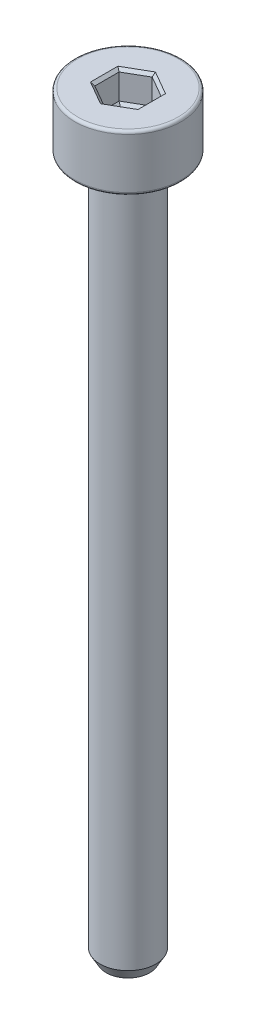
ISO-10303-21;
HEADER;
FILE_DESCRIPTION(('STEP AP214'),'2;1');
FILE_NAME('part.step','',(''),(''),'','','');
FILE_SCHEMA(('AUTOMOTIVE_DESIGN { 1 0 10303 214 1 1 1 1 }'));
ENDSEC;
DATA;
#1=APPLICATION_CONTEXT('core data for automotive mechanical design processes');
#2=APPLICATION_PROTOCOL_DEFINITION('international standard','automotive_design',2000,#1);
#3=PRODUCT_CONTEXT('',#1,'mechanical');
#4=PRODUCT('Part','Part','',(#3));
#5=PRODUCT_RELATED_PRODUCT_CATEGORY('part','',(#4));
#6=PRODUCT_DEFINITION_FORMATION('','',#4);
#7=PRODUCT_DEFINITION_CONTEXT('part definition',#1,'design');
#8=PRODUCT_DEFINITION('design','',#6,#7);
#9=PRODUCT_DEFINITION_SHAPE('','',#8);
#10=(LENGTH_UNIT() NAMED_UNIT(*) SI_UNIT(.MILLI.,.METRE.));
#11=(NAMED_UNIT(*) PLANE_ANGLE_UNIT() SI_UNIT($,.RADIAN.));
#12=(NAMED_UNIT(*) SI_UNIT($,.STERADIAN.) SOLID_ANGLE_UNIT());
#13=UNCERTAINTY_MEASURE_WITH_UNIT(LENGTH_MEASURE(1.E-05),#10,'distance_accuracy_value','');
#14=(GEOMETRIC_REPRESENTATION_CONTEXT(3) GLOBAL_UNCERTAINTY_ASSIGNED_CONTEXT((#13)) GLOBAL_UNIT_ASSIGNED_CONTEXT((#10,
#11,#12)) REPRESENTATION_CONTEXT('',''));
#15=CARTESIAN_POINT('',(0.,0.,0.));
#16=DIRECTION('',(0.,0.,1.));
#17=DIRECTION('',(1.,0.,0.));
#18=AXIS2_PLACEMENT_3D('',#15,#16,#17);
#19=CARTESIAN_POINT('',(0.,25.,0.));
#20=DIRECTION('',(0.,-1.,0.));
#21=DIRECTION('',(0.,0.,-1.));
#22=AXIS2_PLACEMENT_3D('',#19,#20,#21);
#23=CYLINDRICAL_SURFACE('',#22,0.999999999999999);
#24=CARTESIAN_POINT('',(0.,0.382679491924304,0.));
#25=DIRECTION('',(0.,1.,0.));
#26=DIRECTION('',(-1.,0.,0.));
#27=AXIS2_PLACEMENT_3D('',#24,#25,#26);
#28=CIRCLE('',#27,0.999999999999999);
#29=CARTESIAN_POINT('',(-1.,0.382679491924301,0.));
#30=VERTEX_POINT('',#29);
#31=EDGE_CURVE('E290',#30,#30,#28,.T.);
#32=ORIENTED_EDGE('',*,*,#31,.T.);
#33=EDGE_LOOP('',(#32));
#34=FACE_BOUND('',#33,.T.);
#35=CARTESIAN_POINT('',(0.,25.,0.));
#36=DIRECTION('',(0.,1.,0.));
#37=DIRECTION('',(0.,0.,1.));
#38=AXIS2_PLACEMENT_3D('',#35,#36,#37);
#39=CIRCLE('',#38,0.999999999999999);
#40=CARTESIAN_POINT('',(0.,25.,0.999999999999999));
#41=VERTEX_POINT('',#40);
#42=EDGE_CURVE('E198',#41,#41,#39,.T.);
#43=ORIENTED_EDGE('',*,*,#42,.F.);
#44=EDGE_LOOP('',(#43));
#45=FACE_BOUND('',#44,.T.);
#46=ADVANCED_FACE('F47',(#34,#45),#23,.T.);
#47=CARTESIAN_POINT('',(0.,27.,0.));
#48=DIRECTION('',(0.,-1.,0.));
#49=DIRECTION('',(0.,0.,-1.));
#50=AXIS2_PLACEMENT_3D('',#47,#48,#49);
#51=CYLINDRICAL_SURFACE('',#50,1.9);
#52=CARTESIAN_POINT('',(0.,25.1,0.));
#53=DIRECTION('',(0.,1.,0.));
#54=DIRECTION('',(0.,0.,1.));
#55=AXIS2_PLACEMENT_3D('',#52,#53,#54);
#56=CIRCLE('',#55,1.9);
#57=CARTESIAN_POINT('',(0.,25.1,1.9));
#58=VERTEX_POINT('',#57);
#59=EDGE_CURVE('E217',#58,#58,#56,.T.);
#60=ORIENTED_EDGE('',*,*,#59,.T.);
#61=EDGE_LOOP('',(#60));
#62=FACE_BOUND('',#61,.T.);
#63=CARTESIAN_POINT('',(0.,26.9,0.));
#64=DIRECTION('',(0.,1.,0.));
#65=DIRECTION('',(0.,0.,1.));
#66=AXIS2_PLACEMENT_3D('',#63,#64,#65);
#67=CIRCLE('',#66,1.9);
#68=CARTESIAN_POINT('',(0.,26.9,1.9));
#69=VERTEX_POINT('',#68);
#70=EDGE_CURVE('E213',#69,#69,#67,.F.);
#71=ORIENTED_EDGE('',*,*,#70,.T.);
#72=EDGE_LOOP('',(#71));
#73=FACE_BOUND('',#72,.T.);
#74=ADVANCED_FACE('F376',(#62,#73),#51,.T.);
#75=CARTESIAN_POINT('',(0.,27.,0.));
#76=DIRECTION('',(0.,1.,0.));
#77=DIRECTION('',(0.,0.,1.));
#78=AXIS2_PLACEMENT_3D('',#75,#76,#77);
#79=PLANE('',#78);
#80=DIRECTION('',(-0.866025403784439,0.,-0.5));
#81=VECTOR('',#80,1.);
#82=CARTESIAN_POINT('',(-0.799999999999999,27.,0.519615242270661));
#83=LINE('',#82,#81);
#84=CARTESIAN_POINT('',(0.,27.,0.981495457622362));
#85=VERTEX_POINT('',#84);
#86=CARTESIAN_POINT('',(-0.849999999999998,27.,0.490747728811181));
#87=VERTEX_POINT('',#86);
#88=EDGE_CURVE('E244',#85,#87,#83,.T.);
#89=ORIENTED_EDGE('',*,*,#88,.T.);
#90=DIRECTION('',(0.,0.,-1.));
#91=VECTOR('',#90,1.);
#92=CARTESIAN_POINT('',(-0.849999999999998,27.,-0.43301270189222));
#93=LINE('',#92,#91);
#94=CARTESIAN_POINT('',(-0.849999999999998,27.,-0.490747728811181));
#95=VERTEX_POINT('',#94);
#96=EDGE_CURVE('E247',#87,#95,#93,.T.);
#97=ORIENTED_EDGE('',*,*,#96,.T.);
#98=DIRECTION('',(0.866025403784439,0.,-0.5));
#99=VECTOR('',#98,1.);
#100=CARTESIAN_POINT('',(-0.0499999999999989,27.,-0.952627944162881));
#101=LINE('',#100,#99);
#102=CARTESIAN_POINT('',(0.,27.,-0.981495457622362));
#103=VERTEX_POINT('',#102);
#104=EDGE_CURVE('E232',#95,#103,#101,.T.);
#105=ORIENTED_EDGE('',*,*,#104,.T.);
#106=DIRECTION('',(0.866025403784439,0.,0.5));
#107=VECTOR('',#106,1.);
#108=CARTESIAN_POINT('',(0.799999999999998,27.,-0.519615242270662));
#109=LINE('',#108,#107);
#110=CARTESIAN_POINT('',(0.849999999999997,27.,-0.490747728811181));
#111=VERTEX_POINT('',#110);
#112=EDGE_CURVE('E235',#103,#111,#109,.T.);
#113=ORIENTED_EDGE('',*,*,#112,.T.);
#114=DIRECTION('',(0.,0.,1.));
#115=VECTOR('',#114,1.);
#116=CARTESIAN_POINT('',(0.849999999999997,27.,0.43301270189222));
#117=LINE('',#116,#115);
#118=CARTESIAN_POINT('',(0.849999999999997,27.,0.490747728811182));
#119=VERTEX_POINT('',#118);
#120=EDGE_CURVE('E238',#111,#119,#117,.T.);
#121=ORIENTED_EDGE('',*,*,#120,.T.);
#122=DIRECTION('',(-0.866025403784439,0.,0.5));
#123=VECTOR('',#122,1.);
#124=CARTESIAN_POINT('',(0.0499999999999987,27.,0.952627944162881));
#125=LINE('',#124,#123);
#126=EDGE_CURVE('E241',#119,#85,#125,.T.);
#127=ORIENTED_EDGE('',*,*,#126,.T.);
#128=EDGE_LOOP('',(#89,#97,#105,#113,#121,#127));
#129=FACE_BOUND('',#128,.T.);
#130=CARTESIAN_POINT('',(0.,27.,0.));
#131=DIRECTION('',(0.,1.,0.));
#132=DIRECTION('',(0.,0.,1.));
#133=AXIS2_PLACEMENT_3D('',#130,#131,#132);
#134=CIRCLE('',#133,1.8);
#135=CARTESIAN_POINT('',(0.,27.,1.8));
#136=VERTEX_POINT('',#135);
#137=EDGE_CURVE('E225',#136,#136,#134,.T.);
#138=ORIENTED_EDGE('',*,*,#137,.T.);
#139=EDGE_LOOP('',(#138));
#140=FACE_BOUND('',#139,.T.);
#141=ADVANCED_FACE('F384',(#129,#140),#79,.T.);
#142=CARTESIAN_POINT('',(0.,25.,0.));
#143=DIRECTION('',(0.,1.,0.));
#144=DIRECTION('',(0.,0.,1.));
#145=AXIS2_PLACEMENT_3D('',#142,#143,#144);
#146=PLANE('',#145);
#147=CARTESIAN_POINT('',(0.,25.,0.));
#148=DIRECTION('',(0.,1.,0.));
#149=DIRECTION('',(0.,0.,1.));
#150=AXIS2_PLACEMENT_3D('',#147,#148,#149);
#151=CIRCLE('',#150,1.8);
#152=CARTESIAN_POINT('',(0.,25.,1.8));
#153=VERTEX_POINT('',#152);
#154=EDGE_CURVE('E221',#153,#153,#151,.F.);
#155=ORIENTED_EDGE('',*,*,#154,.T.);
#156=EDGE_LOOP('',(#155));
#157=FACE_BOUND('',#156,.T.);
#158=ORIENTED_EDGE('',*,*,#42,.T.);
#159=EDGE_LOOP('',(#158));
#160=FACE_BOUND('',#159,.T.);
#161=ADVANCED_FACE('F372',(#157,#160),#146,.F.);
#162=CARTESIAN_POINT('',(0.749999999999999,26.,-0.43301270189222));
#163=DIRECTION('',(0.5,0.,-0.866025403784439));
#164=DIRECTION('',(-0.866025403784439,0.,-0.5));
#165=AXIS2_PLACEMENT_3D('',#162,#163,#164);
#166=PLANE('',#165);
#167=DIRECTION('',(0.,1.,0.));
#168=VECTOR('',#167,1.);
#169=CARTESIAN_POINT('',(0.749999999999999,26.,-0.43301270189222));
#170=LINE('',#169,#168);
#171=CARTESIAN_POINT('',(0.749999999999995,26.,-0.433012701892228));
#172=VERTEX_POINT('',#171);
#173=CARTESIAN_POINT('',(0.749999999999999,26.9,-0.43301270189222));
#174=VERTEX_POINT('',#173);
#175=EDGE_CURVE('E195',#172,#174,#170,.T.);
#176=ORIENTED_EDGE('',*,*,#175,.T.);
#177=DIRECTION('',(-0.866025403784439,0.,-0.5));
#178=VECTOR('',#177,1.);
#179=CARTESIAN_POINT('',(0.,26.9,-0.866025403784439));
#180=LINE('',#179,#178);
#181=CARTESIAN_POINT('',(0.,26.9,-0.866025403784439));
#182=VERTEX_POINT('',#181);
#183=EDGE_CURVE('E58',#174,#182,#180,.T.);
#184=ORIENTED_EDGE('',*,*,#183,.T.);
#185=DIRECTION('',(0.,1.,0.));
#186=VECTOR('',#185,1.);
#187=CARTESIAN_POINT('',(0.,26.,-0.866025403784439));
#188=LINE('',#187,#186);
#189=CARTESIAN_POINT('',(0.,26.,-0.866025403784439));
#190=VERTEX_POINT('',#189);
#191=EDGE_CURVE('E174',#190,#182,#188,.T.);
#192=ORIENTED_EDGE('',*,*,#191,.F.);
#193=DIRECTION('',(-0.866025403784439,0.,-0.5));
#194=VECTOR('',#193,1.);
#195=CARTESIAN_POINT('',(0.749999999999999,26.,-0.43301270189222));
#196=LINE('',#195,#194);
#197=EDGE_CURVE('E163',#172,#190,#196,.T.);
#198=ORIENTED_EDGE('',*,*,#197,.F.);
#199=EDGE_LOOP('',(#176,#184,#192,#198));
#200=FACE_BOUND('',#199,.T.);
#201=ADVANCED_FACE('F305',(#200),#166,.F.);
#202=CARTESIAN_POINT('',(0.749999999999999,26.,0.43301270189222));
#203=DIRECTION('',(1.,0.,0.));
#204=DIRECTION('',(0.,0.,-1.));
#205=AXIS2_PLACEMENT_3D('',#202,#203,#204);
#206=PLANE('',#205);
#207=DIRECTION('',(0.,1.,0.));
#208=VECTOR('',#207,1.);
#209=CARTESIAN_POINT('',(0.749999999999999,26.,0.43301270189222));
#210=LINE('',#209,#208);
#211=CARTESIAN_POINT('',(0.750000000000004,26.,0.433012701892213));
#212=VERTEX_POINT('',#211);
#213=CARTESIAN_POINT('',(0.749999999999999,26.9,0.43301270189222));
#214=VERTEX_POINT('',#213);
#215=EDGE_CURVE('E199',#212,#214,#210,.T.);
#216=ORIENTED_EDGE('',*,*,#215,.T.);
#217=DIRECTION('',(0.,0.,-1.));
#218=VECTOR('',#217,1.);
#219=CARTESIAN_POINT('',(0.749999999999999,26.9,-0.43301270189222));
#220=LINE('',#219,#218);
#221=EDGE_CURVE('E73',#214,#174,#220,.T.);
#222=ORIENTED_EDGE('',*,*,#221,.T.);
#223=ORIENTED_EDGE('',*,*,#175,.F.);
#224=DIRECTION('',(0.,0.,-1.));
#225=VECTOR('',#224,1.);
#226=CARTESIAN_POINT('',(0.749999999999999,26.,0.43301270189222));
#227=LINE('',#226,#225);
#228=EDGE_CURVE('E191',#212,#172,#227,.T.);
#229=ORIENTED_EDGE('',*,*,#228,.F.);
#230=EDGE_LOOP('',(#216,#222,#223,#229));
#231=FACE_BOUND('',#230,.T.);
#232=ADVANCED_FACE('F361',(#231),#206,.F.);
#233=CARTESIAN_POINT('',(0.,26.,0.866025403784439));
#234=DIRECTION('',(0.5,0.,0.866025403784439));
#235=DIRECTION('',(0.866025403784439,0.,-0.5));
#236=AXIS2_PLACEMENT_3D('',#233,#234,#235);
#237=PLANE('',#236);
#238=DIRECTION('',(0.,1.,0.));
#239=VECTOR('',#238,1.);
#240=CARTESIAN_POINT('',(0.,26.,0.866025403784439));
#241=LINE('',#240,#239);
#242=CARTESIAN_POINT('',(0.,26.,0.866025403784439));
#243=VERTEX_POINT('',#242);
#244=CARTESIAN_POINT('',(0.,26.9,0.866025403784439));
#245=VERTEX_POINT('',#244);
#246=EDGE_CURVE('E202',#243,#245,#241,.T.);
#247=ORIENTED_EDGE('',*,*,#246,.T.);
#248=DIRECTION('',(0.866025403784439,0.,-0.5));
#249=VECTOR('',#248,1.);
#250=CARTESIAN_POINT('',(0.749999999999999,26.9,0.43301270189222));
#251=LINE('',#250,#249);
#252=EDGE_CURVE('E254',#245,#214,#251,.T.);
#253=ORIENTED_EDGE('',*,*,#252,.T.);
#254=ORIENTED_EDGE('',*,*,#215,.F.);
#255=DIRECTION('',(0.866025403784439,0.,-0.5));
#256=VECTOR('',#255,1.);
#257=CARTESIAN_POINT('',(0.,26.,0.866025403784439));
#258=LINE('',#257,#256);
#259=EDGE_CURVE('E184',#243,#212,#258,.T.);
#260=ORIENTED_EDGE('',*,*,#259,.F.);
#261=EDGE_LOOP('',(#247,#253,#254,#260));
#262=FACE_BOUND('',#261,.T.);
#263=ADVANCED_FACE('F364',(#262),#237,.F.);
#264=CARTESIAN_POINT('',(-0.75,26.,0.43301270189222));
#265=DIRECTION('',(-0.5,0.,0.866025403784438));
#266=DIRECTION('',(0.866025403784439,0.,0.5));
#267=AXIS2_PLACEMENT_3D('',#264,#265,#266);
#268=PLANE('',#267);
#269=DIRECTION('',(0.,1.,0.));
#270=VECTOR('',#269,1.);
#271=CARTESIAN_POINT('',(-0.75,26.,0.43301270189222));
#272=LINE('',#271,#270);
#273=CARTESIAN_POINT('',(-0.749999999999998,26.,0.433012701892223));
#274=VERTEX_POINT('',#273);
#275=CARTESIAN_POINT('',(-0.75,26.9,0.43301270189222));
#276=VERTEX_POINT('',#275);
#277=EDGE_CURVE('E173',#274,#276,#272,.T.);
#278=ORIENTED_EDGE('',*,*,#277,.T.);
#279=DIRECTION('',(0.866025403784439,0.,0.5));
#280=VECTOR('',#279,1.);
#281=CARTESIAN_POINT('',(0.,26.9,0.866025403784439));
#282=LINE('',#281,#280);
#283=EDGE_CURVE('E251',#276,#245,#282,.T.);
#284=ORIENTED_EDGE('',*,*,#283,.T.);
#285=ORIENTED_EDGE('',*,*,#246,.F.);
#286=DIRECTION('',(0.866025403784438,0.,0.5));
#287=VECTOR('',#286,1.);
#288=CARTESIAN_POINT('',(-0.75,26.,0.43301270189222));
#289=LINE('',#288,#287);
#290=EDGE_CURVE('E180',#274,#243,#289,.T.);
#291=ORIENTED_EDGE('',*,*,#290,.F.);
#292=EDGE_LOOP('',(#278,#284,#285,#291));
#293=FACE_BOUND('',#292,.T.);
#294=ADVANCED_FACE('F318',(#293),#268,.F.);
#295=CARTESIAN_POINT('',(-0.75,26.,-0.43301270189222));
#296=DIRECTION('',(-1.,0.,0.));
#297=DIRECTION('',(0.,0.,1.));
#298=AXIS2_PLACEMENT_3D('',#295,#296,#297);
#299=PLANE('',#298);
#300=DIRECTION('',(0.,1.,0.));
#301=VECTOR('',#300,1.);
#302=CARTESIAN_POINT('',(-0.75,26.,-0.43301270189222));
#303=LINE('',#302,#301);
#304=CARTESIAN_POINT('',(-0.750000000000001,26.,-0.433012701892218));
#305=VERTEX_POINT('',#304);
#306=CARTESIAN_POINT('',(-0.75,26.9,-0.43301270189222));
#307=VERTEX_POINT('',#306);
#308=EDGE_CURVE('E166',#305,#307,#303,.T.);
#309=ORIENTED_EDGE('',*,*,#308,.T.);
#310=DIRECTION('',(0.,0.,1.));
#311=VECTOR('',#310,1.);
#312=CARTESIAN_POINT('',(-0.75,26.9,0.43301270189222));
#313=LINE('',#312,#311);
#314=EDGE_CURVE('E229',#307,#276,#313,.T.);
#315=ORIENTED_EDGE('',*,*,#314,.T.);
#316=ORIENTED_EDGE('',*,*,#277,.F.);
#317=DIRECTION('',(0.,0.,1.));
#318=VECTOR('',#317,1.);
#319=CARTESIAN_POINT('',(-0.75,26.,-0.43301270189222));
#320=LINE('',#319,#318);
#321=EDGE_CURVE('E145',#305,#274,#320,.T.);
#322=ORIENTED_EDGE('',*,*,#321,.F.);
#323=EDGE_LOOP('',(#309,#315,#316,#322));
#324=FACE_BOUND('',#323,.T.);
#325=ADVANCED_FACE('F176',(#324),#299,.F.);
#326=CARTESIAN_POINT('',(0.,26.,-0.866025403784439));
#327=DIRECTION('',(-0.5,0.,-0.866025403784439));
#328=DIRECTION('',(-0.866025403784439,0.,0.5));
#329=AXIS2_PLACEMENT_3D('',#326,#327,#328);
#330=PLANE('',#329);
#331=ORIENTED_EDGE('',*,*,#191,.T.);
#332=DIRECTION('',(-0.866025403784439,0.,0.5));
#333=VECTOR('',#332,1.);
#334=CARTESIAN_POINT('',(-0.75,26.9,-0.43301270189222));
#335=LINE('',#334,#333);
#336=EDGE_CURVE('E11',#182,#307,#335,.T.);
#337=ORIENTED_EDGE('',*,*,#336,.T.);
#338=ORIENTED_EDGE('',*,*,#308,.F.);
#339=DIRECTION('',(-0.866025403784439,0.,0.5));
#340=VECTOR('',#339,1.);
#341=CARTESIAN_POINT('',(0.,26.,-0.866025403784439));
#342=LINE('',#341,#340);
#343=EDGE_CURVE('E158',#190,#305,#342,.T.);
#344=ORIENTED_EDGE('',*,*,#343,.F.);
#345=EDGE_LOOP('',(#331,#337,#338,#344));
#346=FACE_BOUND('',#345,.T.);
#347=ADVANCED_FACE('F167',(#346),#330,.F.);
#348=CARTESIAN_POINT('',(0.,25.1,0.));
#349=DIRECTION('',(0.,1.,0.));
#350=DIRECTION('',(0.,0.,1.));
#351=AXIS2_PLACEMENT_3D('',#348,#349,#350);
#352=TOROIDAL_SURFACE('',#351,1.8,0.1);
#353=ORIENTED_EDGE('',*,*,#154,.F.);
#354=EDGE_LOOP('',(#353));
#355=FACE_BOUND('',#354,.T.);
#356=ORIENTED_EDGE('',*,*,#59,.F.);
#357=EDGE_LOOP('',(#356));
#358=FACE_BOUND('',#357,.T.);
#359=ADVANCED_FACE('F391',(#355,#358),#352,.T.);
#360=CARTESIAN_POINT('',(0.,26.9,0.));
#361=DIRECTION('',(0.,1.,0.));
#362=DIRECTION('',(0.,0.,1.));
#363=AXIS2_PLACEMENT_3D('',#360,#361,#362);
#364=TOROIDAL_SURFACE('',#363,1.8,0.1);
#365=ORIENTED_EDGE('',*,*,#70,.F.);
#366=EDGE_LOOP('',(#365));
#367=FACE_BOUND('',#366,.T.);
#368=ORIENTED_EDGE('',*,*,#137,.F.);
#369=EDGE_LOOP('',(#368));
#370=FACE_BOUND('',#369,.T.);
#371=ADVANCED_FACE('F394',(#367,#370),#364,.T.);
#372=CARTESIAN_POINT('',(0.,0.399999999999997,0.));
#373=DIRECTION('',(0.,1.,0.));
#374=DIRECTION('',(-1.,0.,0.));
#375=AXIS2_PLACEMENT_3D('',#372,#373,#374);
#376=CONICAL_SURFACE('',#375,1.01,0.523598775598307);
#377=CARTESIAN_POINT('',(0.,0.,0.));
#378=DIRECTION('',(0.,-1.,0.));
#379=DIRECTION('',(1.,0.,0.));
#380=AXIS2_PLACEMENT_3D('',#377,#378,#379);
#381=CIRCLE('',#380,0.779059892324147);
#382=CARTESIAN_POINT('',(0.779059892324147,0.,0.));
#383=VERTEX_POINT('',#382);
#384=EDGE_CURVE('E284',#383,#383,#381,.T.);
#385=ORIENTED_EDGE('',*,*,#384,.F.);
#386=EDGE_LOOP('',(#385));
#387=FACE_BOUND('',#386,.T.);
#388=ORIENTED_EDGE('',*,*,#31,.F.);
#389=EDGE_LOOP('',(#388));
#390=FACE_BOUND('',#389,.T.);
#391=ADVANCED_FACE('F397',(#387,#390),#376,.T.);
#392=CARTESIAN_POINT('',(0.,0.,0.));
#393=DIRECTION('',(0.,1.,0.));
#394=DIRECTION('',(0.,0.,1.));
#395=AXIS2_PLACEMENT_3D('',#392,#393,#394);
#396=PLANE('',#395);
#397=ORIENTED_EDGE('',*,*,#384,.T.);
#398=EDGE_LOOP('',(#397));
#399=FACE_BOUND('',#398,.T.);
#400=ADVANCED_FACE('F390',(#399),#396,.F.);
#401=CARTESIAN_POINT('',(0.749999999999999,26.9,0.43301270189222));
#402=DIRECTION('',(-0.707106781186566,0.70710678118653,0.));
#403=DIRECTION('',(0.,0.,1.));
#404=AXIS2_PLACEMENT_3D('',#401,#402,#403);
#405=PLANE('',#404);
#406=DIRECTION('',(0.654653670707963,0.654653670707996,0.37796447300922));
#407=VECTOR('',#406,1.);
#408=CARTESIAN_POINT('',(0.535714285714295,26.6857142857143,0.309294787065877));
#409=LINE('',#408,#407);
#410=EDGE_CURVE('E275',#119,#214,#409,.F.);
#411=ORIENTED_EDGE('',*,*,#410,.F.);
#412=ORIENTED_EDGE('',*,*,#120,.F.);
#413=DIRECTION('',(0.654653670707963,0.654653670707996,-0.37796447300922));
#414=VECTOR('',#413,1.);
#415=CARTESIAN_POINT('',(0.535714285714294,26.6857142857143,-0.309294787065876));
#416=LINE('',#415,#414);
#417=EDGE_CURVE('E52',#174,#111,#416,.T.);
#418=ORIENTED_EDGE('',*,*,#417,.F.);
#419=ORIENTED_EDGE('',*,*,#221,.F.);
#420=EDGE_LOOP('',(#411,#412,#418,#419));
#421=FACE_BOUND('',#420,.T.);
#422=ADVANCED_FACE('F50',(#421),#405,.T.);
#423=CARTESIAN_POINT('',(0.749999999999999,26.9,-0.43301270189222));
#424=DIRECTION('',(-0.353553390593283,0.70710678118653,0.61237243569581));
#425=DIRECTION('',(0.866025403784439,0.,0.5));
#426=AXIS2_PLACEMENT_3D('',#423,#424,#425);
#427=PLANE('',#426);
#428=ORIENTED_EDGE('',*,*,#417,.T.);
#429=ORIENTED_EDGE('',*,*,#112,.F.);
#430=DIRECTION('',(0.,0.654653670707996,-0.755928946018438));
#431=VECTOR('',#430,1.);
#432=CARTESIAN_POINT('',(0.,26.6857142857143,-0.618589574131754));
#433=LINE('',#432,#431);
#434=EDGE_CURVE('E272',#182,#103,#433,.T.);
#435=ORIENTED_EDGE('',*,*,#434,.F.);
#436=ORIENTED_EDGE('',*,*,#183,.F.);
#437=EDGE_LOOP('',(#428,#429,#435,#436));
#438=FACE_BOUND('',#437,.T.);
#439=ADVANCED_FACE('F307',(#438),#427,.T.);
#440=CARTESIAN_POINT('',(0.,26.9,0.866025403784439));
#441=DIRECTION('',(-0.353553390593283,0.70710678118653,-0.61237243569581));
#442=DIRECTION('',(-0.866025403784439,0.,0.5));
#443=AXIS2_PLACEMENT_3D('',#440,#441,#442);
#444=PLANE('',#443);
#445=ORIENTED_EDGE('',*,*,#410,.T.);
#446=ORIENTED_EDGE('',*,*,#252,.F.);
#447=DIRECTION('',(0.,0.654653670707996,0.755928946018438));
#448=VECTOR('',#447,1.);
#449=CARTESIAN_POINT('',(0.,26.6857142857143,0.618589574131752));
#450=LINE('',#449,#448);
#451=EDGE_CURVE('E268',#85,#245,#450,.F.);
#452=ORIENTED_EDGE('',*,*,#451,.F.);
#453=ORIENTED_EDGE('',*,*,#126,.F.);
#454=EDGE_LOOP('',(#445,#446,#452,#453));
#455=FACE_BOUND('',#454,.T.);
#456=ADVANCED_FACE('F417',(#455),#444,.T.);
#457=CARTESIAN_POINT('',(0.,26.9,-0.866025403784439));
#458=DIRECTION('',(0.353553390593283,0.707106781186529,0.61237243569581));
#459=DIRECTION('',(0.866025403784439,0.,-0.5));
#460=AXIS2_PLACEMENT_3D('',#457,#458,#459);
#461=PLANE('',#460);
#462=ORIENTED_EDGE('',*,*,#434,.T.);
#463=ORIENTED_EDGE('',*,*,#104,.F.);
#464=DIRECTION('',(0.654653670707963,-0.654653670707996,0.377964473009219));
#465=VECTOR('',#464,1.);
#466=CARTESIAN_POINT('',(-0.75,26.9,-0.43301270189222));
#467=LINE('',#466,#465);
#468=EDGE_CURVE('E264',#307,#95,#467,.F.);
#469=ORIENTED_EDGE('',*,*,#468,.F.);
#470=ORIENTED_EDGE('',*,*,#336,.F.);
#471=EDGE_LOOP('',(#462,#463,#469,#470));
#472=FACE_BOUND('',#471,.T.);
#473=ADVANCED_FACE('F310',(#472),#461,.T.);
#474=CARTESIAN_POINT('',(-0.75,26.9,0.43301270189222));
#475=DIRECTION('',(0.353553390593283,0.707106781186529,-0.61237243569581));
#476=DIRECTION('',(-0.866025403784439,0.,-0.5));
#477=AXIS2_PLACEMENT_3D('',#474,#475,#476);
#478=PLANE('',#477);
#479=ORIENTED_EDGE('',*,*,#451,.T.);
#480=ORIENTED_EDGE('',*,*,#283,.F.);
#481=DIRECTION('',(-0.654653670707963,0.654653670707996,0.377964473009218));
#482=VECTOR('',#481,1.);
#483=CARTESIAN_POINT('',(-0.535714285714296,26.6857142857143,0.309294787065877));
#484=LINE('',#483,#482);
#485=EDGE_CURVE('E261',#87,#276,#484,.F.);
#486=ORIENTED_EDGE('',*,*,#485,.F.);
#487=ORIENTED_EDGE('',*,*,#88,.F.);
#488=EDGE_LOOP('',(#479,#480,#486,#487));
#489=FACE_BOUND('',#488,.T.);
#490=ADVANCED_FACE('F405',(#489),#478,.T.);
#491=CARTESIAN_POINT('',(-0.75,26.9,-0.43301270189222));
#492=DIRECTION('',(0.707106781186566,0.70710678118653,0.));
#493=DIRECTION('',(0.,0.,-1.));
#494=AXIS2_PLACEMENT_3D('',#491,#492,#493);
#495=PLANE('',#494);
#496=ORIENTED_EDGE('',*,*,#468,.T.);
#497=ORIENTED_EDGE('',*,*,#96,.F.);
#498=ORIENTED_EDGE('',*,*,#485,.T.);
#499=ORIENTED_EDGE('',*,*,#314,.F.);
#500=EDGE_LOOP('',(#496,#497,#498,#499));
#501=FACE_BOUND('',#500,.T.);
#502=ADVANCED_FACE('F314',(#501),#495,.T.);
#503=CARTESIAN_POINT('',(0.749999999999995,26.,-0.433012701892228));
#504=DIRECTION('',(0.35355339059327,-0.707106781186549,-0.612372435695795));
#505=DIRECTION('',(0.,0.654653670707977,-0.755928946018455));
#506=AXIS2_PLACEMENT_3D('',#503,#504,#505);
#507=PLANE('',#506);
#508=ORIENTED_EDGE('',*,*,#197,.T.);
#509=DIRECTION('',(0.,0.654653670707976,-0.755928946018455));
#510=VECTOR('',#509,1.);
#511=CARTESIAN_POINT('',(0.,25.7857142857143,-0.618589574131745));
#512=LINE('',#511,#510);
#513=CARTESIAN_POINT('',(0.,25.9,-0.750555349946514));
#514=VERTEX_POINT('',#513);
#515=EDGE_CURVE('E154',#514,#190,#512,.T.);
#516=ORIENTED_EDGE('',*,*,#515,.F.);
#517=DIRECTION('',(-0.866025403784441,0.,-0.499999999999995));
#518=VECTOR('',#517,1.);
#519=CARTESIAN_POINT('',(0.324999999999998,25.9,-0.562916512459889));
#520=LINE('',#519,#518);
#521=CARTESIAN_POINT('',(0.649999999999996,25.9,-0.375277674973265));
#522=VERTEX_POINT('',#521);
#523=EDGE_CURVE('E337',#522,#514,#520,.T.);
#524=ORIENTED_EDGE('',*,*,#523,.F.);
#525=DIRECTION('',(0.654653670707975,0.654653670707976,-0.377964473009233));
#526=VECTOR('',#525,1.);
#527=CARTESIAN_POINT('',(0.535714285714282,25.7857142857143,-0.309294787065878));
#528=LINE('',#527,#526);
#529=EDGE_CURVE('E265',#522,#172,#528,.T.);
#530=ORIENTED_EDGE('',*,*,#529,.T.);
#531=EDGE_LOOP('',(#508,#516,#524,#530));
#532=FACE_BOUND('',#531,.T.);
#533=ADVANCED_FACE('F303',(#532),#507,.F.);
#534=CARTESIAN_POINT('',(0.750000000000004,26.,0.433012701892213));
#535=DIRECTION('',(0.707106781186546,-0.707106781186549,0.));
#536=DIRECTION('',(0.707106781186549,0.707106781186546,0.));
#537=AXIS2_PLACEMENT_3D('',#534,#535,#536);
#538=PLANE('',#537);
#539=ORIENTED_EDGE('',*,*,#228,.T.);
#540=ORIENTED_EDGE('',*,*,#529,.F.);
#541=DIRECTION('',(0.,0.,-1.));
#542=VECTOR('',#541,1.);
#543=CARTESIAN_POINT('',(0.65,25.9,0.));
#544=LINE('',#543,#542);
#545=CARTESIAN_POINT('',(0.650000000000004,25.9,0.375277674973251));
#546=VERTEX_POINT('',#545);
#547=EDGE_CURVE('E341',#546,#522,#544,.T.);
#548=ORIENTED_EDGE('',*,*,#547,.F.);
#549=DIRECTION('',(0.654653670707982,0.654653670707976,0.377964473009222));
#550=VECTOR('',#549,1.);
#551=CARTESIAN_POINT('',(0.535714285714287,25.7857142857143,0.309294787065865));
#552=LINE('',#551,#550);
#553=EDGE_CURVE('E331',#546,#212,#552,.T.);
#554=ORIENTED_EDGE('',*,*,#553,.T.);
#555=EDGE_LOOP('',(#539,#540,#548,#554));
#556=FACE_BOUND('',#555,.T.);
#557=ADVANCED_FACE('F356',(#556),#538,.F.);
#558=CARTESIAN_POINT('',(0.,26.,0.866025403784439));
#559=DIRECTION('',(0.353553390593278,-0.707106781186549,0.612372435695791));
#560=DIRECTION('',(0.,-0.654653670707974,-0.755928946018457));
#561=AXIS2_PLACEMENT_3D('',#558,#559,#560);
#562=PLANE('',#561);
#563=ORIENTED_EDGE('',*,*,#259,.T.);
#564=ORIENTED_EDGE('',*,*,#553,.F.);
#565=DIRECTION('',(0.866025403784435,0.,-0.500000000000007));
#566=VECTOR('',#565,1.);
#567=CARTESIAN_POINT('',(0.325000000000005,25.9,0.562916512459883));
#568=LINE('',#567,#566);
#569=CARTESIAN_POINT('',(0.,25.9,0.750555349946514));
#570=VERTEX_POINT('',#569);
#571=EDGE_CURVE('E345',#570,#546,#568,.T.);
#572=ORIENTED_EDGE('',*,*,#571,.F.);
#573=DIRECTION('',(0.,0.654653670707976,0.755928946018456));
#574=VECTOR('',#573,1.);
#575=CARTESIAN_POINT('',(0.,25.7857142857143,0.61858957413174));
#576=LINE('',#575,#574);
#577=EDGE_CURVE('E324',#570,#243,#576,.T.);
#578=ORIENTED_EDGE('',*,*,#577,.T.);
#579=EDGE_LOOP('',(#563,#564,#572,#578));
#580=FACE_BOUND('',#579,.T.);
#581=ADVANCED_FACE('F482',(#580),#562,.F.);
#582=CARTESIAN_POINT('',(-0.749999999999998,26.,0.433012701892223));
#583=DIRECTION('',(-0.35355339059327,-0.707106781186549,0.612372435695795));
#584=DIRECTION('',(0.,-0.654653670707977,-0.755928946018455));
#585=AXIS2_PLACEMENT_3D('',#582,#583,#584);
#586=PLANE('',#585);
#587=ORIENTED_EDGE('',*,*,#290,.T.);
#588=ORIENTED_EDGE('',*,*,#577,.F.);
#589=DIRECTION('',(0.866025403784441,0.,0.499999999999995));
#590=VECTOR('',#589,1.);
#591=CARTESIAN_POINT('',(-0.324999999999997,25.9,0.562916512459887));
#592=LINE('',#591,#590);
#593=CARTESIAN_POINT('',(-0.649999999999999,25.9,0.37527767497326));
#594=VERTEX_POINT('',#593);
#595=EDGE_CURVE('E327',#594,#570,#592,.T.);
#596=ORIENTED_EDGE('',*,*,#595,.F.);
#597=DIRECTION('',(-0.654653670707977,0.654653670707976,0.377964473009231));
#598=VECTOR('',#597,1.);
#599=CARTESIAN_POINT('',(-0.535714285714283,25.7857142857143,0.309294787065873));
#600=LINE('',#599,#598);
#601=EDGE_CURVE('E153',#594,#274,#600,.T.);
#602=ORIENTED_EDGE('',*,*,#601,.T.);
#603=EDGE_LOOP('',(#587,#588,#596,#602));
#604=FACE_BOUND('',#603,.T.);
#605=ADVANCED_FACE('F322',(#604),#586,.F.);
#606=CARTESIAN_POINT('',(-0.750000000000001,26.,-0.433012701892218));
#607=DIRECTION('',(-0.707106781186546,-0.707106781186549,0.));
#608=DIRECTION('',(0.707106781186549,-0.707106781186546,0.));
#609=AXIS2_PLACEMENT_3D('',#606,#607,#608);
#610=PLANE('',#609);
#611=ORIENTED_EDGE('',*,*,#321,.T.);
#612=ORIENTED_EDGE('',*,*,#601,.F.);
#613=DIRECTION('',(0.,0.,1.));
#614=VECTOR('',#613,1.);
#615=CARTESIAN_POINT('',(-0.65,25.9,0.));
#616=LINE('',#615,#614);
#617=CARTESIAN_POINT('',(-0.650000000000001,25.9,-0.375277674973255));
#618=VERTEX_POINT('',#617);
#619=EDGE_CURVE('E148',#618,#594,#616,.T.);
#620=ORIENTED_EDGE('',*,*,#619,.F.);
#621=DIRECTION('',(-0.654653670707979,0.654653670707976,-0.377964473009226));
#622=VECTOR('',#621,1.);
#623=CARTESIAN_POINT('',(-0.535714285714285,25.7857142857143,-0.309294787065869));
#624=LINE('',#623,#622);
#625=EDGE_CURVE('E141',#618,#305,#624,.T.);
#626=ORIENTED_EDGE('',*,*,#625,.T.);
#627=EDGE_LOOP('',(#611,#612,#620,#626));
#628=FACE_BOUND('',#627,.T.);
#629=ADVANCED_FACE('F143',(#628),#610,.F.);
#630=CARTESIAN_POINT('',(0.,26.,-0.866025403784439));
#631=DIRECTION('',(-0.353553390593274,-0.707106781186549,-0.612372435695793));
#632=DIRECTION('',(0.,0.654653670707976,-0.755928946018456));
#633=AXIS2_PLACEMENT_3D('',#630,#631,#632);
#634=PLANE('',#633);
#635=ORIENTED_EDGE('',*,*,#343,.T.);
#636=ORIENTED_EDGE('',*,*,#625,.F.);
#637=DIRECTION('',(-0.866025403784438,0.,0.500000000000001));
#638=VECTOR('',#637,1.);
#639=CARTESIAN_POINT('',(-0.325000000000001,25.9,-0.562916512459885));
#640=LINE('',#639,#638);
#641=EDGE_CURVE('E298',#514,#618,#640,.T.);
#642=ORIENTED_EDGE('',*,*,#641,.F.);
#643=ORIENTED_EDGE('',*,*,#515,.T.);
#644=EDGE_LOOP('',(#635,#636,#642,#643));
#645=FACE_BOUND('',#644,.T.);
#646=ADVANCED_FACE('F160',(#645),#634,.F.);
#647=CARTESIAN_POINT('',(0.,25.9,0.));
#648=DIRECTION('',(0.,1.,0.));
#649=DIRECTION('',(0.,0.,1.));
#650=AXIS2_PLACEMENT_3D('',#647,#648,#649);
#651=PLANE('',#650);
#652=ORIENTED_EDGE('',*,*,#523,.T.);
#653=ORIENTED_EDGE('',*,*,#641,.T.);
#654=ORIENTED_EDGE('',*,*,#619,.T.);
#655=ORIENTED_EDGE('',*,*,#595,.T.);
#656=ORIENTED_EDGE('',*,*,#571,.T.);
#657=ORIENTED_EDGE('',*,*,#547,.T.);
#658=EDGE_LOOP('',(#652,#653,#654,#655,#656,#657));
#659=FACE_BOUND('',#658,.T.);
#660=ADVANCED_FACE('F353',(#659),#651,.T.);
#661=CLOSED_SHELL('',(#46,#74,#141,#161,#201,#232,#263,#294,#325,#347,#359,#371,#391,#400,#422,
#439,#456,#473,#490,#502,#533,#557,#581,#605,#629,#646,#660));
#662=MANIFOLD_SOLID_BREP('B2',#661);
#663=ADVANCED_BREP_SHAPE_REPRESENTATION('',(#18,#662),#14);
#664=SHAPE_DEFINITION_REPRESENTATION(#9,#663);
ENDSEC;
END-ISO-10303-21;
